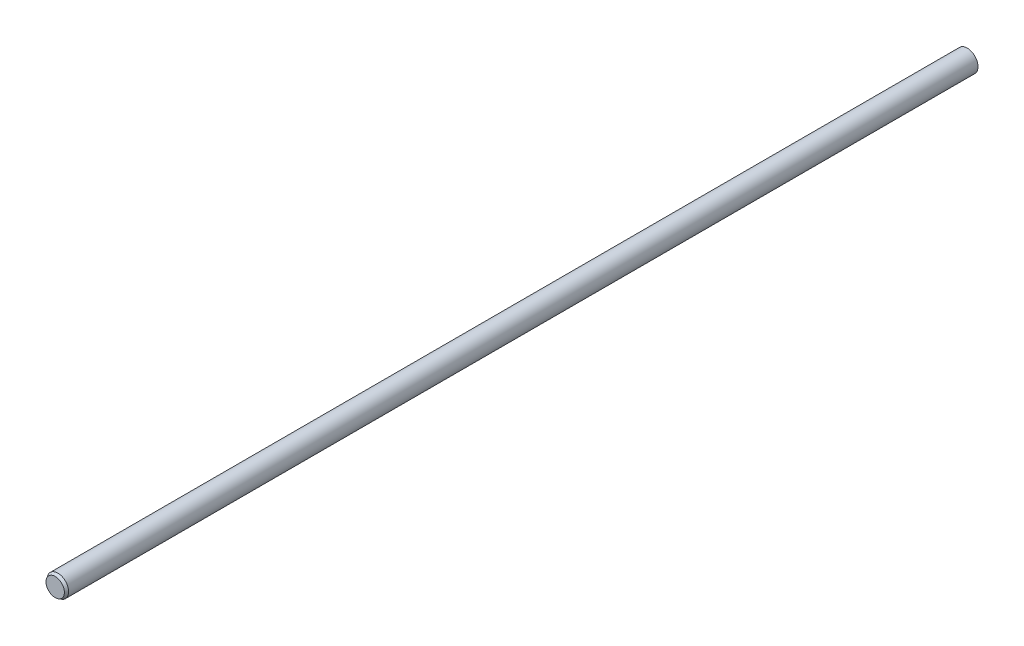
ISO-10303-21;
HEADER;
FILE_DESCRIPTION(('STEP AP214'),'2;1');
FILE_NAME('part.step','',(''),(''),'','','');
FILE_SCHEMA(('AUTOMOTIVE_DESIGN { 1 0 10303 214 1 1 1 1 }'));
ENDSEC;
DATA;
#1=APPLICATION_CONTEXT('core data for automotive mechanical design processes');
#2=APPLICATION_PROTOCOL_DEFINITION('international standard','automotive_design',2000,#1);
#3=PRODUCT_CONTEXT('',#1,'mechanical');
#4=PRODUCT('Part','Part','',(#3));
#5=PRODUCT_RELATED_PRODUCT_CATEGORY('part','',(#4));
#6=PRODUCT_DEFINITION_FORMATION('','',#4);
#7=PRODUCT_DEFINITION_CONTEXT('part definition',#1,'design');
#8=PRODUCT_DEFINITION('design','',#6,#7);
#9=PRODUCT_DEFINITION_SHAPE('','',#8);
#10=(LENGTH_UNIT() NAMED_UNIT(*) SI_UNIT(.MILLI.,.METRE.));
#11=(NAMED_UNIT(*) PLANE_ANGLE_UNIT() SI_UNIT($,.RADIAN.));
#12=(NAMED_UNIT(*) SI_UNIT($,.STERADIAN.) SOLID_ANGLE_UNIT());
#13=UNCERTAINTY_MEASURE_WITH_UNIT(LENGTH_MEASURE(1.E-05),#10,'distance_accuracy_value','');
#14=(GEOMETRIC_REPRESENTATION_CONTEXT(3) GLOBAL_UNCERTAINTY_ASSIGNED_CONTEXT((#13)) GLOBAL_UNIT_ASSIGNED_CONTEXT((#10,
#11,#12)) REPRESENTATION_CONTEXT('',''));
#15=CARTESIAN_POINT('',(0.,0.,0.));
#16=DIRECTION('',(0.,0.,1.));
#17=DIRECTION('',(1.,0.,0.));
#18=AXIS2_PLACEMENT_3D('',#15,#16,#17);
#19=CARTESIAN_POINT('',(0.,0.,340.));
#20=DIRECTION('',(0.,0.,-1.));
#21=DIRECTION('',(-1.,0.,0.));
#22=AXIS2_PLACEMENT_3D('',#19,#20,#21);
#23=CYLINDRICAL_SURFACE('',#22,4.);
#24=CARTESIAN_POINT('',(0.,0.,0.577350269189592));
#25=DIRECTION('',(0.,0.,1.));
#26=DIRECTION('',(1.,0.,0.));
#27=AXIS2_PLACEMENT_3D('',#24,#25,#26);
#28=CIRCLE('',#27,4.);
#29=CARTESIAN_POINT('',(4.,0.,0.577350269189592));
#30=VERTEX_POINT('',#29);
#31=EDGE_CURVE('E53',#30,#30,#28,.T.);
#32=ORIENTED_EDGE('',*,*,#31,.T.);
#33=EDGE_LOOP('',(#32));
#34=FACE_BOUND('',#33,.T.);
#35=CARTESIAN_POINT('',(0.,0.,339.));
#36=DIRECTION('',(0.,0.,1.));
#37=DIRECTION('',(1.,0.,0.));
#38=AXIS2_PLACEMENT_3D('',#35,#36,#37);
#39=CIRCLE('',#38,4.);
#40=CARTESIAN_POINT('',(4.,0.,339.));
#41=VERTEX_POINT('',#40);
#42=EDGE_CURVE('E58',#41,#41,#39,.F.);
#43=ORIENTED_EDGE('',*,*,#42,.T.);
#44=EDGE_LOOP('',(#43));
#45=FACE_BOUND('',#44,.T.);
#46=ADVANCED_FACE('F40',(#34,#45),#23,.T.);
#47=CARTESIAN_POINT('',(0.,0.,340.));
#48=DIRECTION('',(0.,0.,1.));
#49=DIRECTION('',(1.,0.,0.));
#50=AXIS2_PLACEMENT_3D('',#47,#48,#49);
#51=PLANE('',#50);
#52=CARTESIAN_POINT('',(0.,0.,340.));
#53=DIRECTION('',(0.,0.,1.));
#54=DIRECTION('',(1.,0.,0.));
#55=AXIS2_PLACEMENT_3D('',#52,#53,#54);
#56=CIRCLE('',#55,3.42264973081041);
#57=CARTESIAN_POINT('',(3.42264973081041,0.,340.));
#58=VERTEX_POINT('',#57);
#59=EDGE_CURVE('E10',#58,#58,#56,.T.);
#60=ORIENTED_EDGE('',*,*,#59,.T.);
#61=EDGE_LOOP('',(#60));
#62=FACE_BOUND('',#61,.T.);
#63=ADVANCED_FACE('F75',(#62),#51,.T.);
#64=CARTESIAN_POINT('',(0.,0.,0.));
#65=DIRECTION('',(0.,0.,1.));
#66=DIRECTION('',(1.,0.,0.));
#67=AXIS2_PLACEMENT_3D('',#64,#65,#66);
#68=PLANE('',#67);
#69=CARTESIAN_POINT('',(0.,0.,0.));
#70=DIRECTION('',(0.,0.,1.));
#71=DIRECTION('',(1.,0.,0.));
#72=AXIS2_PLACEMENT_3D('',#69,#70,#71);
#73=CIRCLE('',#72,3.);
#74=CARTESIAN_POINT('',(3.,0.,0.));
#75=VERTEX_POINT('',#74);
#76=EDGE_CURVE('E48',#75,#75,#73,.F.);
#77=ORIENTED_EDGE('',*,*,#76,.T.);
#78=EDGE_LOOP('',(#77));
#79=FACE_BOUND('',#78,.T.);
#80=ADVANCED_FACE('F72',(#79),#68,.F.);
#81=CARTESIAN_POINT('',(0.,0.,0.577350269189592));
#82=DIRECTION('',(0.,0.,1.));
#83=DIRECTION('',(1.,0.,0.));
#84=AXIS2_PLACEMENT_3D('',#81,#82,#83);
#85=CONICAL_SURFACE('',#84,4.,1.04719755119662);
#86=ORIENTED_EDGE('',*,*,#76,.F.);
#87=EDGE_LOOP('',(#86));
#88=FACE_BOUND('',#87,.T.);
#89=ORIENTED_EDGE('',*,*,#31,.F.);
#90=EDGE_LOOP('',(#89));
#91=FACE_BOUND('',#90,.T.);
#92=ADVANCED_FACE('F68',(#88,#91),#85,.T.);
#93=CARTESIAN_POINT('',(0.,0.,340.));
#94=DIRECTION('',(0.,0.,-1.));
#95=DIRECTION('',(-1.,0.,0.));
#96=AXIS2_PLACEMENT_3D('',#93,#94,#95);
#97=CONICAL_SURFACE('',#96,3.42264973081041,0.523598775598294);
#98=ORIENTED_EDGE('',*,*,#42,.F.);
#99=EDGE_LOOP('',(#98));
#100=FACE_BOUND('',#99,.T.);
#101=ORIENTED_EDGE('',*,*,#59,.F.);
#102=EDGE_LOOP('',(#101));
#103=FACE_BOUND('',#102,.T.);
#104=ADVANCED_FACE('F42',(#100,#103),#97,.T.);
#105=CLOSED_SHELL('',(#46,#63,#80,#92,#104));
#106=MANIFOLD_SOLID_BREP('B2',#105);
#107=ADVANCED_BREP_SHAPE_REPRESENTATION('',(#18,#106),#14);
#108=SHAPE_DEFINITION_REPRESENTATION(#9,#107);
ENDSEC;
END-ISO-10303-21;
